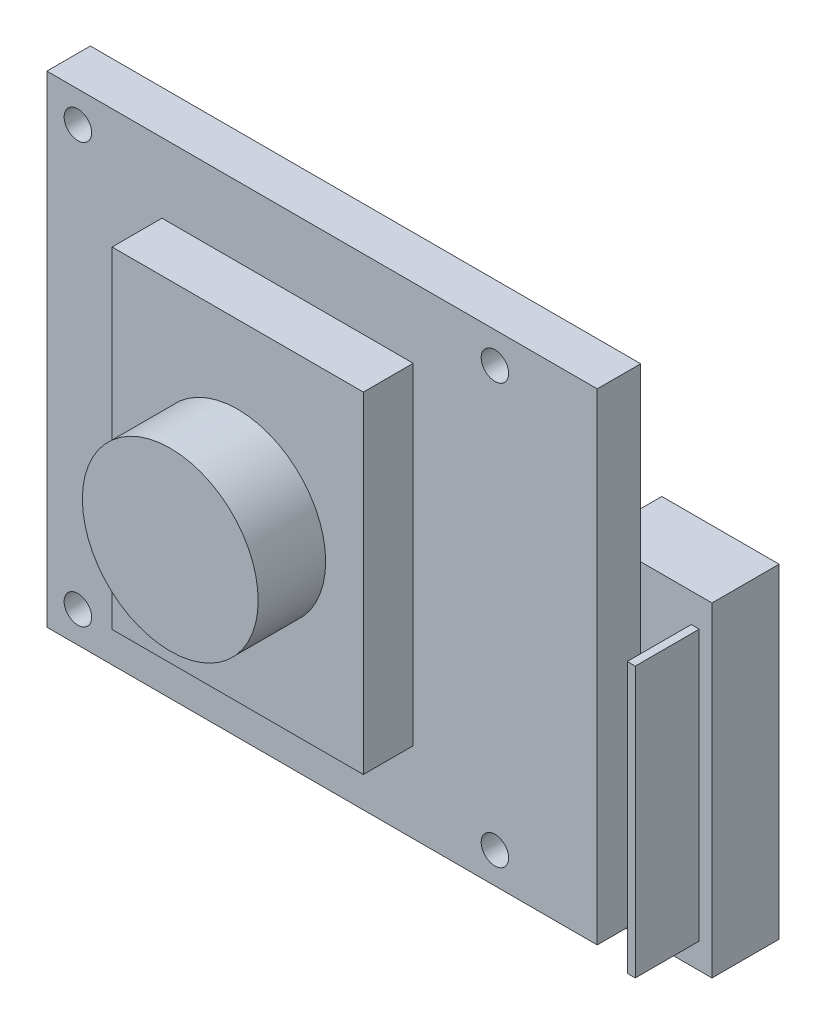
ISO-10303-21;
HEADER;
FILE_DESCRIPTION(('STEP AP214'),'2;1');
FILE_NAME('part.step','',(''),(''),'','','');
FILE_SCHEMA(('AUTOMOTIVE_DESIGN { 1 0 10303 214 1 1 1 1 }'));
ENDSEC;
DATA;
#1=APPLICATION_CONTEXT('core data for automotive mechanical design processes');
#2=APPLICATION_PROTOCOL_DEFINITION('international standard','automotive_design',2000,#1);
#3=PRODUCT_CONTEXT('',#1,'mechanical');
#4=PRODUCT('Part','Part','',(#3));
#5=PRODUCT_RELATED_PRODUCT_CATEGORY('part','',(#4));
#6=PRODUCT_DEFINITION_FORMATION('','',#4);
#7=PRODUCT_DEFINITION_CONTEXT('part definition',#1,'design');
#8=PRODUCT_DEFINITION('design','',#6,#7);
#9=PRODUCT_DEFINITION_SHAPE('','',#8);
#10=(LENGTH_UNIT() NAMED_UNIT(*) SI_UNIT(.MILLI.,.METRE.));
#11=(NAMED_UNIT(*) PLANE_ANGLE_UNIT() SI_UNIT($,.RADIAN.));
#12=(NAMED_UNIT(*) SI_UNIT($,.STERADIAN.) SOLID_ANGLE_UNIT());
#13=UNCERTAINTY_MEASURE_WITH_UNIT(LENGTH_MEASURE(1.E-05),#10,'distance_accuracy_value','');
#14=(GEOMETRIC_REPRESENTATION_CONTEXT(3) GLOBAL_UNCERTAINTY_ASSIGNED_CONTEXT((#13)) GLOBAL_UNIT_ASSIGNED_CONTEXT((#10,
#11,#12)) REPRESENTATION_CONTEXT('',''));
#15=CARTESIAN_POINT('',(0.,0.,0.));
#16=DIRECTION('',(0.,0.,1.));
#17=DIRECTION('',(1.,0.,0.));
#18=AXIS2_PLACEMENT_3D('',#15,#16,#17);
#19=CARTESIAN_POINT('',(-43.7261,38.2651,0.));
#20=DIRECTION('',(0.,0.,-1.));
#21=DIRECTION('',(-1.,0.,0.));
#22=AXIS2_PLACEMENT_3D('',#19,#20,#21);
#23=PLANE('',#22);
#24=CARTESIAN_POINT('',(-25.4381,30.0482,0.));
#25=DIRECTION('',(0.,0.,-1.));
#26=DIRECTION('',(-1.,0.,0.));
#27=AXIS2_PLACEMENT_3D('',#24,#25,#26);
#28=CIRCLE('',#27,1.524);
#29=CARTESIAN_POINT('',(-26.9621,30.0482,0.));
#30=VERTEX_POINT('',#29);
#31=EDGE_CURVE('E452',#30,#30,#28,.T.);
#32=ORIENTED_EDGE('',*,*,#31,.F.);
#33=EDGE_LOOP('',(#32));
#34=FACE_BOUND('',#33,.T.);
#35=CARTESIAN_POINT('',(-8.128,35.8013,0.));
#36=DIRECTION('',(0.,0.,-1.));
#37=DIRECTION('',(-1.,0.,0.));
#38=AXIS2_PLACEMENT_3D('',#35,#36,#37);
#39=CIRCLE('',#38,1.0922);
#40=CARTESIAN_POINT('',(-9.2202,35.8013,0.));
#41=VERTEX_POINT('',#40);
#42=EDGE_CURVE('E173',#41,#41,#39,.T.);
#43=ORIENTED_EDGE('',*,*,#42,.F.);
#44=EDGE_LOOP('',(#43));
#45=FACE_BOUND('',#44,.T.);
#46=CARTESIAN_POINT('',(-8.128,2.4638,0.));
#47=DIRECTION('',(0.,0.,-1.));
#48=DIRECTION('',(-1.,0.,0.));
#49=AXIS2_PLACEMENT_3D('',#46,#47,#48);
#50=CIRCLE('',#49,1.0922);
#51=CARTESIAN_POINT('',(-9.2202,2.4638,0.));
#52=VERTEX_POINT('',#51);
#53=EDGE_CURVE('E184',#52,#52,#50,.T.);
#54=ORIENTED_EDGE('',*,*,#53,.F.);
#55=EDGE_LOOP('',(#54));
#56=FACE_BOUND('',#55,.T.);
#57=CARTESIAN_POINT('',(-41.2623,2.4638,0.));
#58=DIRECTION('',(0.,0.,-1.));
#59=DIRECTION('',(-1.,0.,0.));
#60=AXIS2_PLACEMENT_3D('',#57,#58,#59);
#61=CIRCLE('',#60,1.0922);
#62=CARTESIAN_POINT('',(-42.3545,2.4638,0.));
#63=VERTEX_POINT('',#62);
#64=EDGE_CURVE('E190',#63,#63,#61,.T.);
#65=ORIENTED_EDGE('',*,*,#64,.F.);
#66=EDGE_LOOP('',(#65));
#67=FACE_BOUND('',#66,.T.);
#68=CARTESIAN_POINT('',(-41.2623,35.8013,0.));
#69=DIRECTION('',(0.,0.,-1.));
#70=DIRECTION('',(-1.,0.,0.));
#71=AXIS2_PLACEMENT_3D('',#68,#69,#70);
#72=CIRCLE('',#71,1.0922);
#73=CARTESIAN_POINT('',(-42.3545,35.8013,0.));
#74=VERTEX_POINT('',#73);
#75=EDGE_CURVE('E196',#74,#74,#72,.T.);
#76=ORIENTED_EDGE('',*,*,#75,.F.);
#77=EDGE_LOOP('',(#76));
#78=FACE_BOUND('',#77,.T.);
#79=DIRECTION('',(0.,1.,0.));
#80=VECTOR('',#79,1.);
#81=CARTESIAN_POINT('',(-3.6576,-1.1684,0.));
#82=LINE('',#81,#80);
#83=CARTESIAN_POINT('',(-3.65760000000001,0.,0.));
#84=VERTEX_POINT('',#83);
#85=CARTESIAN_POINT('',(-3.6576,24.638,0.));
#86=VERTEX_POINT('',#85);
#87=EDGE_CURVE('E40',#84,#86,#82,.T.);
#88=ORIENTED_EDGE('',*,*,#87,.F.);
#89=DIRECTION('',(1.,0.,0.));
#90=VECTOR('',#89,1.);
#91=CARTESIAN_POINT('',(-43.7261,0.,0.));
#92=LINE('',#91,#90);
#93=CARTESIAN_POINT('',(-43.7261,0.,0.));
#94=VERTEX_POINT('',#93);
#95=EDGE_CURVE('E282',#94,#84,#92,.T.);
#96=ORIENTED_EDGE('',*,*,#95,.F.);
#97=DIRECTION('',(0.,-1.,0.));
#98=VECTOR('',#97,1.);
#99=CARTESIAN_POINT('',(-43.7261,0.,0.));
#100=LINE('',#99,#98);
#101=CARTESIAN_POINT('',(-43.7261,38.2651,0.));
#102=VERTEX_POINT('',#101);
#103=EDGE_CURVE('E267',#102,#94,#100,.T.);
#104=ORIENTED_EDGE('',*,*,#103,.F.);
#105=DIRECTION('',(-1.,0.,0.));
#106=VECTOR('',#105,1.);
#107=CARTESIAN_POINT('',(-43.7261,38.2651,0.));
#108=LINE('',#107,#106);
#109=CARTESIAN_POINT('',(0.,38.2651,0.));
#110=VERTEX_POINT('',#109);
#111=EDGE_CURVE('E272',#110,#102,#108,.T.);
#112=ORIENTED_EDGE('',*,*,#111,.F.);
#113=DIRECTION('',(0.,1.,0.));
#114=VECTOR('',#113,1.);
#115=CARTESIAN_POINT('',(0.,0.,0.));
#116=LINE('',#115,#114);
#117=CARTESIAN_POINT('',(0.,24.638,0.));
#118=VERTEX_POINT('',#117);
#119=EDGE_CURVE('E285',#118,#110,#116,.T.);
#120=ORIENTED_EDGE('',*,*,#119,.F.);
#121=DIRECTION('',(1.,0.,0.));
#122=VECTOR('',#121,1.);
#123=CARTESIAN_POINT('',(-3.6576,24.638,0.));
#124=LINE('',#123,#122);
#125=EDGE_CURVE('E250',#86,#118,#124,.T.);
#126=ORIENTED_EDGE('',*,*,#125,.F.);
#127=EDGE_LOOP('',(#88,#96,#104,#112,#120,#126));
#128=FACE_BOUND('',#127,.T.);
#129=CARTESIAN_POINT('',(-25.4381,8.128,0.));
#130=DIRECTION('',(0.,0.,-1.));
#131=DIRECTION('',(-1.,0.,0.));
#132=AXIS2_PLACEMENT_3D('',#129,#130,#131);
#133=CIRCLE('',#132,1.524);
#134=CARTESIAN_POINT('',(-26.9621,8.128,0.));
#135=VERTEX_POINT('',#134);
#136=EDGE_CURVE('E453',#135,#135,#133,.T.);
#137=ORIENTED_EDGE('',*,*,#136,.F.);
#138=EDGE_LOOP('',(#137));
#139=FACE_BOUND('',#138,.T.);
#140=ADVANCED_FACE('F32',(#34,#45,#56,#67,#78,#128,#139),#23,.T.);
#141=CARTESIAN_POINT('',(-34.5821,32.7152,7.4168));
#142=DIRECTION('',(0.,0.,-1.));
#143=DIRECTION('',(-1.,0.,0.));
#144=AXIS2_PLACEMENT_3D('',#141,#142,#143);
#145=PLANE('',#144);
#146=DIRECTION('',(0.,-1.,0.));
#147=VECTOR('',#146,1.);
#148=CARTESIAN_POINT('',(-34.5821,6.4008,7.4168));
#149=LINE('',#148,#147);
#150=CARTESIAN_POINT('',(-34.5821,32.7152,7.4168));
#151=VERTEX_POINT('',#150);
#152=CARTESIAN_POINT('',(-34.5821,6.4008,7.4168));
#153=VERTEX_POINT('',#152);
#154=EDGE_CURVE('E159',#151,#153,#149,.T.);
#155=ORIENTED_EDGE('',*,*,#154,.T.);
#156=DIRECTION('',(1.,0.,0.));
#157=VECTOR('',#156,1.);
#158=CARTESIAN_POINT('',(-34.5821,6.4008,7.4168));
#159=LINE('',#158,#157);
#160=CARTESIAN_POINT('',(-14.6177,6.4008,7.4168));
#161=VERTEX_POINT('',#160);
#162=EDGE_CURVE('E148',#153,#161,#159,.T.);
#163=ORIENTED_EDGE('',*,*,#162,.T.);
#164=DIRECTION('',(0.,1.,0.));
#165=VECTOR('',#164,1.);
#166=CARTESIAN_POINT('',(-14.6177,6.4008,7.4168));
#167=LINE('',#166,#165);
#168=CARTESIAN_POINT('',(-14.6177,32.7152,7.4168));
#169=VERTEX_POINT('',#168);
#170=EDGE_CURVE('E158',#161,#169,#167,.T.);
#171=ORIENTED_EDGE('',*,*,#170,.T.);
#172=DIRECTION('',(-1.,0.,0.));
#173=VECTOR('',#172,1.);
#174=CARTESIAN_POINT('',(-34.5821,32.7152,7.4168));
#175=LINE('',#174,#173);
#176=EDGE_CURVE('E165',#169,#151,#175,.T.);
#177=ORIENTED_EDGE('',*,*,#176,.T.);
#178=EDGE_LOOP('',(#155,#163,#171,#177));
#179=FACE_BOUND('',#178,.T.);
#180=CARTESIAN_POINT('',(-24.5999,19.558,7.4168));
#181=DIRECTION('',(0.,0.,-1.));
#182=DIRECTION('',(-1.,0.,0.));
#183=AXIS2_PLACEMENT_3D('',#180,#181,#182);
#184=CIRCLE('',#183,6.985);
#185=CARTESIAN_POINT('',(-31.5849,19.558,7.4168));
#186=VERTEX_POINT('',#185);
#187=EDGE_CURVE('E11',#186,#186,#184,.F.);
#188=ORIENTED_EDGE('',*,*,#187,.F.);
#189=EDGE_LOOP('',(#188));
#190=FACE_BOUND('',#189,.T.);
#191=ADVANCED_FACE('F162',(#179,#190),#145,.F.);
#192=CARTESIAN_POINT('',(-43.7261,38.2651,3.4544));
#193=DIRECTION('',(0.,0.,-1.));
#194=DIRECTION('',(-1.,0.,0.));
#195=AXIS2_PLACEMENT_3D('',#192,#193,#194);
#196=PLANE('',#195);
#197=DIRECTION('',(0.,-1.,0.));
#198=VECTOR('',#197,1.);
#199=CARTESIAN_POINT('',(-43.7261,0.,3.4544));
#200=LINE('',#199,#198);
#201=CARTESIAN_POINT('',(-43.7261,38.2651,3.4544));
#202=VERTEX_POINT('',#201);
#203=CARTESIAN_POINT('',(-43.7261,0.,3.4544));
#204=VERTEX_POINT('',#203);
#205=EDGE_CURVE('E268',#202,#204,#200,.T.);
#206=ORIENTED_EDGE('',*,*,#205,.T.);
#207=DIRECTION('',(1.,0.,0.));
#208=VECTOR('',#207,1.);
#209=CARTESIAN_POINT('',(-43.7261,0.,3.4544));
#210=LINE('',#209,#208);
#211=CARTESIAN_POINT('',(0.,0.,3.4544));
#212=VERTEX_POINT('',#211);
#213=EDGE_CURVE('E271',#204,#212,#210,.T.);
#214=ORIENTED_EDGE('',*,*,#213,.T.);
#215=DIRECTION('',(0.,1.,0.));
#216=VECTOR('',#215,1.);
#217=CARTESIAN_POINT('',(0.,0.,3.4544));
#218=LINE('',#217,#216);
#219=CARTESIAN_POINT('',(0.,38.2651,3.4544));
#220=VERTEX_POINT('',#219);
#221=EDGE_CURVE('E274',#212,#220,#218,.T.);
#222=ORIENTED_EDGE('',*,*,#221,.T.);
#223=DIRECTION('',(-1.,0.,0.));
#224=VECTOR('',#223,1.);
#225=CARTESIAN_POINT('',(-43.7261,38.2651,3.4544));
#226=LINE('',#225,#224);
#227=EDGE_CURVE('E276',#220,#202,#226,.T.);
#228=ORIENTED_EDGE('',*,*,#227,.T.);
#229=EDGE_LOOP('',(#206,#214,#222,#228));
#230=FACE_BOUND('',#229,.T.);
#231=CARTESIAN_POINT('',(-41.2623,35.8013,3.4544));
#232=DIRECTION('',(0.,0.,-1.));
#233=DIRECTION('',(-1.,0.,0.));
#234=AXIS2_PLACEMENT_3D('',#231,#232,#233);
#235=CIRCLE('',#234,1.0922);
#236=CARTESIAN_POINT('',(-42.3545,35.8013,3.4544));
#237=VERTEX_POINT('',#236);
#238=EDGE_CURVE('E199',#237,#237,#235,.T.);
#239=ORIENTED_EDGE('',*,*,#238,.T.);
#240=EDGE_LOOP('',(#239));
#241=FACE_BOUND('',#240,.T.);
#242=CARTESIAN_POINT('',(-41.2623,2.4638,3.4544));
#243=DIRECTION('',(0.,0.,-1.));
#244=DIRECTION('',(-1.,0.,0.));
#245=AXIS2_PLACEMENT_3D('',#242,#243,#244);
#246=CIRCLE('',#245,1.0922);
#247=CARTESIAN_POINT('',(-42.3545,2.4638,3.4544));
#248=VERTEX_POINT('',#247);
#249=EDGE_CURVE('E193',#248,#248,#246,.T.);
#250=ORIENTED_EDGE('',*,*,#249,.T.);
#251=EDGE_LOOP('',(#250));
#252=FACE_BOUND('',#251,.T.);
#253=CARTESIAN_POINT('',(-8.128,2.4638,3.4544));
#254=DIRECTION('',(0.,0.,-1.));
#255=DIRECTION('',(-1.,0.,0.));
#256=AXIS2_PLACEMENT_3D('',#253,#254,#255);
#257=CIRCLE('',#256,1.0922);
#258=CARTESIAN_POINT('',(-9.2202,2.4638,3.4544));
#259=VERTEX_POINT('',#258);
#260=EDGE_CURVE('E187',#259,#259,#257,.T.);
#261=ORIENTED_EDGE('',*,*,#260,.T.);
#262=EDGE_LOOP('',(#261));
#263=FACE_BOUND('',#262,.T.);
#264=CARTESIAN_POINT('',(-8.128,35.8013,3.4544));
#265=DIRECTION('',(0.,0.,-1.));
#266=DIRECTION('',(-1.,0.,0.));
#267=AXIS2_PLACEMENT_3D('',#264,#265,#266);
#268=CIRCLE('',#267,1.0922);
#269=CARTESIAN_POINT('',(-9.2202,35.8013,3.4544));
#270=VERTEX_POINT('',#269);
#271=EDGE_CURVE('E176',#270,#270,#268,.T.);
#272=ORIENTED_EDGE('',*,*,#271,.T.);
#273=EDGE_LOOP('',(#272));
#274=FACE_BOUND('',#273,.T.);
#275=DIRECTION('',(0.,-1.,0.));
#276=VECTOR('',#275,1.);
#277=CARTESIAN_POINT('',(-34.5821,6.4008,3.4544));
#278=LINE('',#277,#276);
#279=CARTESIAN_POINT('',(-34.5821,32.7152,3.4544));
#280=VERTEX_POINT('',#279);
#281=CARTESIAN_POINT('',(-34.5821,6.4008,3.4544));
#282=VERTEX_POINT('',#281);
#283=EDGE_CURVE('E172',#280,#282,#278,.T.);
#284=ORIENTED_EDGE('',*,*,#283,.F.);
#285=DIRECTION('',(-1.,0.,0.));
#286=VECTOR('',#285,1.);
#287=CARTESIAN_POINT('',(-34.5821,32.7152,3.4544));
#288=LINE('',#287,#286);
#289=CARTESIAN_POINT('',(-14.6177,32.7152,3.4544));
#290=VERTEX_POINT('',#289);
#291=EDGE_CURVE('E169',#290,#280,#288,.T.);
#292=ORIENTED_EDGE('',*,*,#291,.F.);
#293=DIRECTION('',(0.,1.,0.));
#294=VECTOR('',#293,1.);
#295=CARTESIAN_POINT('',(-14.6177,6.4008,3.4544));
#296=LINE('',#295,#294);
#297=CARTESIAN_POINT('',(-14.6177,6.4008,3.4544));
#298=VERTEX_POINT('',#297);
#299=EDGE_CURVE('E52',#298,#290,#296,.T.);
#300=ORIENTED_EDGE('',*,*,#299,.F.);
#301=DIRECTION('',(1.,0.,0.));
#302=VECTOR('',#301,1.);
#303=CARTESIAN_POINT('',(-34.5821,6.4008,3.4544));
#304=LINE('',#303,#302);
#305=EDGE_CURVE('E47',#282,#298,#304,.T.);
#306=ORIENTED_EDGE('',*,*,#305,.F.);
#307=EDGE_LOOP('',(#284,#292,#300,#306));
#308=FACE_BOUND('',#307,.T.);
#309=ADVANCED_FACE('F333',(#230,#241,#252,#263,#274,#308),#196,.F.);
#310=CARTESIAN_POINT('',(-3.6576,24.638,0.));
#311=DIRECTION('',(0.,0.,-1.));
#312=DIRECTION('',(-1.,0.,0.));
#313=AXIS2_PLACEMENT_3D('',#310,#311,#312);
#314=PLANE('',#313);
#315=CARTESIAN_POINT('',(0.,0.,0.));
#316=VERTEX_POINT('',#315);
#317=EDGE_CURVE('E286',#316,#118,#116,.T.);
#318=ORIENTED_EDGE('',*,*,#317,.F.);
#319=EDGE_CURVE('E281',#84,#316,#92,.T.);
#320=ORIENTED_EDGE('',*,*,#319,.F.);
#321=CARTESIAN_POINT('',(-3.6576,-1.1684,0.));
#322=VERTEX_POINT('',#321);
#323=EDGE_CURVE('E235',#322,#84,#82,.T.);
#324=ORIENTED_EDGE('',*,*,#323,.F.);
#325=DIRECTION('',(-1.,0.,0.));
#326=VECTOR('',#325,1.);
#327=CARTESIAN_POINT('',(-3.6576,-1.1684,0.));
#328=LINE('',#327,#326);
#329=CARTESIAN_POINT('',(5.6642,-1.1684,0.));
#330=VERTEX_POINT('',#329);
#331=EDGE_CURVE('E240',#330,#322,#328,.T.);
#332=ORIENTED_EDGE('',*,*,#331,.F.);
#333=DIRECTION('',(0.,-1.,0.));
#334=VECTOR('',#333,1.);
#335=CARTESIAN_POINT('',(5.6642,-1.1684,0.));
#336=LINE('',#335,#334);
#337=CARTESIAN_POINT('',(5.6642,24.638,0.));
#338=VERTEX_POINT('',#337);
#339=EDGE_CURVE('E253',#338,#330,#336,.T.);
#340=ORIENTED_EDGE('',*,*,#339,.F.);
#341=EDGE_CURVE('E249',#118,#338,#124,.T.);
#342=ORIENTED_EDGE('',*,*,#341,.F.);
#343=EDGE_LOOP('',(#318,#320,#324,#332,#340,#342));
#344=FACE_BOUND('',#343,.T.);
#345=DIRECTION('',(0.,-1.,0.));
#346=VECTOR('',#345,1.);
#347=CARTESIAN_POINT('',(4.0132,0.863599999999999,0.));
#348=LINE('',#347,#346);
#349=CARTESIAN_POINT('',(4.0132,22.3266,0.));
#350=VERTEX_POINT('',#349);
#351=CARTESIAN_POINT('',(4.0132,0.863599999999999,0.));
#352=VERTEX_POINT('',#351);
#353=EDGE_CURVE('E202',#350,#352,#348,.T.);
#354=ORIENTED_EDGE('',*,*,#353,.F.);
#355=DIRECTION('',(-1.,0.,0.));
#356=VECTOR('',#355,1.);
#357=CARTESIAN_POINT('',(4.0132,22.3266,0.));
#358=LINE('',#357,#356);
#359=CARTESIAN_POINT('',(4.6482,22.3266,0.));
#360=VERTEX_POINT('',#359);
#361=EDGE_CURVE('E207',#360,#350,#358,.T.);
#362=ORIENTED_EDGE('',*,*,#361,.F.);
#363=DIRECTION('',(0.,1.,0.));
#364=VECTOR('',#363,1.);
#365=CARTESIAN_POINT('',(4.6482,0.863599999999999,0.));
#366=LINE('',#365,#364);
#367=CARTESIAN_POINT('',(4.6482,0.863599999999999,0.));
#368=VERTEX_POINT('',#367);
#369=EDGE_CURVE('E219',#368,#360,#366,.T.);
#370=ORIENTED_EDGE('',*,*,#369,.F.);
#371=DIRECTION('',(1.,0.,0.));
#372=VECTOR('',#371,1.);
#373=CARTESIAN_POINT('',(4.0132,0.863599999999999,0.));
#374=LINE('',#373,#372);
#375=EDGE_CURVE('E216',#352,#368,#374,.T.);
#376=ORIENTED_EDGE('',*,*,#375,.F.);
#377=EDGE_LOOP('',(#354,#362,#370,#376));
#378=FACE_BOUND('',#377,.T.);
#379=ADVANCED_FACE('F320',(#344,#378),#314,.F.);
#380=CARTESIAN_POINT('',(-43.7261,0.,3.4544));
#381=DIRECTION('',(1.,0.,0.));
#382=DIRECTION('',(0.,0.,-1.));
#383=AXIS2_PLACEMENT_3D('',#380,#381,#382);
#384=PLANE('',#383);
#385=ORIENTED_EDGE('',*,*,#103,.T.);
#386=DIRECTION('',(0.,0.,-1.));
#387=VECTOR('',#386,1.);
#388=CARTESIAN_POINT('',(-43.7261,0.,3.4544));
#389=LINE('',#388,#387);
#390=EDGE_CURVE('E296',#204,#94,#389,.T.);
#391=ORIENTED_EDGE('',*,*,#390,.F.);
#392=ORIENTED_EDGE('',*,*,#205,.F.);
#393=DIRECTION('',(0.,0.,-1.));
#394=VECTOR('',#393,1.);
#395=CARTESIAN_POINT('',(-43.7261,38.2651,3.4544));
#396=LINE('',#395,#394);
#397=EDGE_CURVE('E278',#202,#102,#396,.T.);
#398=ORIENTED_EDGE('',*,*,#397,.T.);
#399=EDGE_LOOP('',(#385,#391,#392,#398));
#400=FACE_BOUND('',#399,.T.);
#401=ADVANCED_FACE('F34',(#400),#384,.F.);
#402=CARTESIAN_POINT('',(-43.7261,0.,3.4544));
#403=DIRECTION('',(0.,1.,0.));
#404=DIRECTION('',(0.,0.,1.));
#405=AXIS2_PLACEMENT_3D('',#402,#403,#404);
#406=PLANE('',#405);
#407=ORIENTED_EDGE('',*,*,#95,.T.);
#408=ORIENTED_EDGE('',*,*,#319,.T.);
#409=DIRECTION('',(0.,0.,-1.));
#410=VECTOR('',#409,1.);
#411=CARTESIAN_POINT('',(0.,0.,3.4544));
#412=LINE('',#411,#410);
#413=EDGE_CURVE('E294',#212,#316,#412,.T.);
#414=ORIENTED_EDGE('',*,*,#413,.F.);
#415=ORIENTED_EDGE('',*,*,#213,.F.);
#416=ORIENTED_EDGE('',*,*,#390,.T.);
#417=EDGE_LOOP('',(#407,#408,#414,#415,#416));
#418=FACE_BOUND('',#417,.T.);
#419=ADVANCED_FACE('F325',(#418),#406,.F.);
#420=CARTESIAN_POINT('',(0.,0.,3.4544));
#421=DIRECTION('',(-1.,0.,0.));
#422=DIRECTION('',(0.,0.,1.));
#423=AXIS2_PLACEMENT_3D('',#420,#421,#422);
#424=PLANE('',#423);
#425=ORIENTED_EDGE('',*,*,#317,.T.);
#426=ORIENTED_EDGE('',*,*,#119,.T.);
#427=DIRECTION('',(0.,0.,-1.));
#428=VECTOR('',#427,1.);
#429=CARTESIAN_POINT('',(0.,38.2651,3.4544));
#430=LINE('',#429,#428);
#431=EDGE_CURVE('E291',#220,#110,#430,.T.);
#432=ORIENTED_EDGE('',*,*,#431,.F.);
#433=ORIENTED_EDGE('',*,*,#221,.F.);
#434=ORIENTED_EDGE('',*,*,#413,.T.);
#435=EDGE_LOOP('',(#425,#426,#432,#433,#434));
#436=FACE_BOUND('',#435,.T.);
#437=ADVANCED_FACE('F328',(#436),#424,.F.);
#438=CARTESIAN_POINT('',(-43.7261,38.2651,3.4544));
#439=DIRECTION('',(0.,-1.,0.));
#440=DIRECTION('',(0.,0.,-1.));
#441=AXIS2_PLACEMENT_3D('',#438,#439,#440);
#442=PLANE('',#441);
#443=ORIENTED_EDGE('',*,*,#111,.T.);
#444=ORIENTED_EDGE('',*,*,#397,.F.);
#445=ORIENTED_EDGE('',*,*,#227,.F.);
#446=ORIENTED_EDGE('',*,*,#431,.T.);
#447=EDGE_LOOP('',(#443,#444,#445,#446));
#448=FACE_BOUND('',#447,.T.);
#449=ADVANCED_FACE('F342',(#448),#442,.F.);
#450=CARTESIAN_POINT('',(-3.6576,-1.1684,-5.334));
#451=DIRECTION('',(1.,0.,0.));
#452=DIRECTION('',(0.,0.,-1.));
#453=AXIS2_PLACEMENT_3D('',#450,#451,#452);
#454=PLANE('',#453);
#455=ORIENTED_EDGE('',*,*,#323,.T.);
#456=ORIENTED_EDGE('',*,*,#87,.T.);
#457=DIRECTION('',(0.,0.,1.));
#458=VECTOR('',#457,1.);
#459=CARTESIAN_POINT('',(-3.6576,24.638,-5.334));
#460=LINE('',#459,#458);
#461=CARTESIAN_POINT('',(-3.6576,24.638,-5.334));
#462=VERTEX_POINT('',#461);
#463=EDGE_CURVE('E264',#462,#86,#460,.T.);
#464=ORIENTED_EDGE('',*,*,#463,.F.);
#465=DIRECTION('',(0.,1.,0.));
#466=VECTOR('',#465,1.);
#467=CARTESIAN_POINT('',(-3.6576,-1.1684,-5.334));
#468=LINE('',#467,#466);
#469=CARTESIAN_POINT('',(-3.6576,-1.1684,-5.334));
#470=VERTEX_POINT('',#469);
#471=EDGE_CURVE('E236',#470,#462,#468,.T.);
#472=ORIENTED_EDGE('',*,*,#471,.F.);
#473=DIRECTION('',(0.,0.,1.));
#474=VECTOR('',#473,1.);
#475=CARTESIAN_POINT('',(-3.6576,-1.1684,-5.334));
#476=LINE('',#475,#474);
#477=EDGE_CURVE('E246',#470,#322,#476,.T.);
#478=ORIENTED_EDGE('',*,*,#477,.T.);
#479=EDGE_LOOP('',(#455,#456,#464,#472,#478));
#480=FACE_BOUND('',#479,.T.);
#481=ADVANCED_FACE('F303',(#480),#454,.F.);
#482=CARTESIAN_POINT('',(-3.6576,24.638,-5.334));
#483=DIRECTION('',(0.,-1.,0.));
#484=DIRECTION('',(0.,0.,-1.));
#485=AXIS2_PLACEMENT_3D('',#482,#483,#484);
#486=PLANE('',#485);
#487=ORIENTED_EDGE('',*,*,#125,.T.);
#488=ORIENTED_EDGE('',*,*,#341,.T.);
#489=DIRECTION('',(0.,0.,1.));
#490=VECTOR('',#489,1.);
#491=CARTESIAN_POINT('',(5.6642,24.638,-5.334));
#492=LINE('',#491,#490);
#493=CARTESIAN_POINT('',(5.6642,24.638,-5.334));
#494=VERTEX_POINT('',#493);
#495=EDGE_CURVE('E261',#494,#338,#492,.T.);
#496=ORIENTED_EDGE('',*,*,#495,.F.);
#497=DIRECTION('',(1.,0.,0.));
#498=VECTOR('',#497,1.);
#499=CARTESIAN_POINT('',(-3.6576,24.638,-5.334));
#500=LINE('',#499,#498);
#501=EDGE_CURVE('E239',#462,#494,#500,.T.);
#502=ORIENTED_EDGE('',*,*,#501,.F.);
#503=ORIENTED_EDGE('',*,*,#463,.T.);
#504=EDGE_LOOP('',(#487,#488,#496,#502,#503));
#505=FACE_BOUND('',#504,.T.);
#506=ADVANCED_FACE('F308',(#505),#486,.F.);
#507=CARTESIAN_POINT('',(5.6642,-1.1684,-5.334));
#508=DIRECTION('',(-1.,0.,0.));
#509=DIRECTION('',(0.,0.,1.));
#510=AXIS2_PLACEMENT_3D('',#507,#508,#509);
#511=PLANE('',#510);
#512=ORIENTED_EDGE('',*,*,#339,.T.);
#513=DIRECTION('',(0.,0.,1.));
#514=VECTOR('',#513,1.);
#515=CARTESIAN_POINT('',(5.6642,-1.1684,-5.334));
#516=LINE('',#515,#514);
#517=CARTESIAN_POINT('',(5.6642,-1.1684,-5.334));
#518=VERTEX_POINT('',#517);
#519=EDGE_CURVE('E258',#518,#330,#516,.T.);
#520=ORIENTED_EDGE('',*,*,#519,.F.);
#521=DIRECTION('',(0.,-1.,0.));
#522=VECTOR('',#521,1.);
#523=CARTESIAN_POINT('',(5.6642,-1.1684,-5.334));
#524=LINE('',#523,#522);
#525=EDGE_CURVE('E242',#494,#518,#524,.T.);
#526=ORIENTED_EDGE('',*,*,#525,.F.);
#527=ORIENTED_EDGE('',*,*,#495,.T.);
#528=EDGE_LOOP('',(#512,#520,#526,#527));
#529=FACE_BOUND('',#528,.T.);
#530=ADVANCED_FACE('F365',(#529),#511,.F.);
#531=CARTESIAN_POINT('',(-3.6576,-1.1684,-5.334));
#532=DIRECTION('',(0.,1.,0.));
#533=DIRECTION('',(-1.,0.,0.));
#534=AXIS2_PLACEMENT_3D('',#531,#532,#533);
#535=PLANE('',#534);
#536=ORIENTED_EDGE('',*,*,#331,.T.);
#537=ORIENTED_EDGE('',*,*,#477,.F.);
#538=DIRECTION('',(-1.,0.,0.));
#539=VECTOR('',#538,1.);
#540=CARTESIAN_POINT('',(-3.6576,-1.1684,-5.334));
#541=LINE('',#540,#539);
#542=EDGE_CURVE('E244',#518,#470,#541,.T.);
#543=ORIENTED_EDGE('',*,*,#542,.F.);
#544=ORIENTED_EDGE('',*,*,#519,.T.);
#545=EDGE_LOOP('',(#536,#537,#543,#544));
#546=FACE_BOUND('',#545,.T.);
#547=ADVANCED_FACE('F368',(#546),#535,.F.);
#548=CARTESIAN_POINT('',(-3.6576,24.638,-5.334));
#549=DIRECTION('',(0.,0.,-1.));
#550=DIRECTION('',(-1.,0.,0.));
#551=AXIS2_PLACEMENT_3D('',#548,#549,#550);
#552=PLANE('',#551);
#553=ORIENTED_EDGE('',*,*,#471,.T.);
#554=ORIENTED_EDGE('',*,*,#501,.T.);
#555=ORIENTED_EDGE('',*,*,#525,.T.);
#556=ORIENTED_EDGE('',*,*,#542,.T.);
#557=EDGE_LOOP('',(#553,#554,#555,#556));
#558=FACE_BOUND('',#557,.T.);
#559=ADVANCED_FACE('F312',(#558),#552,.T.);
#560=CARTESIAN_POINT('',(4.0132,0.863599999999999,5.08));
#561=DIRECTION('',(1.,0.,0.));
#562=DIRECTION('',(0.,0.,-1.));
#563=AXIS2_PLACEMENT_3D('',#560,#561,#562);
#564=PLANE('',#563);
#565=ORIENTED_EDGE('',*,*,#353,.T.);
#566=DIRECTION('',(0.,0.,-1.));
#567=VECTOR('',#566,1.);
#568=CARTESIAN_POINT('',(4.0132,0.863599999999999,5.08));
#569=LINE('',#568,#567);
#570=CARTESIAN_POINT('',(4.0132,0.863599999999999,5.08));
#571=VERTEX_POINT('',#570);
#572=EDGE_CURVE('E232',#571,#352,#569,.T.);
#573=ORIENTED_EDGE('',*,*,#572,.F.);
#574=DIRECTION('',(0.,-1.,0.));
#575=VECTOR('',#574,1.);
#576=CARTESIAN_POINT('',(4.0132,0.863599999999999,5.08));
#577=LINE('',#576,#575);
#578=CARTESIAN_POINT('',(4.0132,22.3266,5.08));
#579=VERTEX_POINT('',#578);
#580=EDGE_CURVE('E203',#579,#571,#577,.T.);
#581=ORIENTED_EDGE('',*,*,#580,.F.);
#582=DIRECTION('',(0.,0.,-1.));
#583=VECTOR('',#582,1.);
#584=CARTESIAN_POINT('',(4.0132,22.3266,5.08));
#585=LINE('',#584,#583);
#586=EDGE_CURVE('E213',#579,#350,#585,.T.);
#587=ORIENTED_EDGE('',*,*,#586,.T.);
#588=EDGE_LOOP('',(#565,#573,#581,#587));
#589=FACE_BOUND('',#588,.T.);
#590=ADVANCED_FACE('F376',(#589),#564,.F.);
#591=CARTESIAN_POINT('',(4.0132,0.863599999999999,5.08));
#592=DIRECTION('',(0.,1.,0.));
#593=DIRECTION('',(0.,0.,1.));
#594=AXIS2_PLACEMENT_3D('',#591,#592,#593);
#595=PLANE('',#594);
#596=ORIENTED_EDGE('',*,*,#375,.T.);
#597=DIRECTION('',(0.,0.,-1.));
#598=VECTOR('',#597,1.);
#599=CARTESIAN_POINT('',(4.6482,0.863599999999999,5.08));
#600=LINE('',#599,#598);
#601=CARTESIAN_POINT('',(4.6482,0.863599999999999,5.08));
#602=VERTEX_POINT('',#601);
#603=EDGE_CURVE('E229',#602,#368,#600,.T.);
#604=ORIENTED_EDGE('',*,*,#603,.F.);
#605=DIRECTION('',(1.,0.,0.));
#606=VECTOR('',#605,1.);
#607=CARTESIAN_POINT('',(4.0132,0.863599999999999,5.08));
#608=LINE('',#607,#606);
#609=EDGE_CURVE('E206',#571,#602,#608,.T.);
#610=ORIENTED_EDGE('',*,*,#609,.F.);
#611=ORIENTED_EDGE('',*,*,#572,.T.);
#612=EDGE_LOOP('',(#596,#604,#610,#611));
#613=FACE_BOUND('',#612,.T.);
#614=ADVANCED_FACE('F379',(#613),#595,.F.);
#615=CARTESIAN_POINT('',(4.6482,0.863599999999999,5.08));
#616=DIRECTION('',(-1.,0.,0.));
#617=DIRECTION('',(0.,0.,1.));
#618=AXIS2_PLACEMENT_3D('',#615,#616,#617);
#619=PLANE('',#618);
#620=ORIENTED_EDGE('',*,*,#369,.T.);
#621=DIRECTION('',(0.,0.,-1.));
#622=VECTOR('',#621,1.);
#623=CARTESIAN_POINT('',(4.6482,22.3266,5.08));
#624=LINE('',#623,#622);
#625=CARTESIAN_POINT('',(4.6482,22.3266,5.08));
#626=VERTEX_POINT('',#625);
#627=EDGE_CURVE('E226',#626,#360,#624,.T.);
#628=ORIENTED_EDGE('',*,*,#627,.F.);
#629=DIRECTION('',(0.,1.,0.));
#630=VECTOR('',#629,1.);
#631=CARTESIAN_POINT('',(4.6482,0.863599999999999,5.08));
#632=LINE('',#631,#630);
#633=EDGE_CURVE('E209',#602,#626,#632,.T.);
#634=ORIENTED_EDGE('',*,*,#633,.F.);
#635=ORIENTED_EDGE('',*,*,#603,.T.);
#636=EDGE_LOOP('',(#620,#628,#634,#635));
#637=FACE_BOUND('',#636,.T.);
#638=ADVANCED_FACE('F383',(#637),#619,.F.);
#639=CARTESIAN_POINT('',(4.0132,22.3266,5.08));
#640=DIRECTION('',(0.,-1.,0.));
#641=DIRECTION('',(0.,0.,-1.));
#642=AXIS2_PLACEMENT_3D('',#639,#640,#641);
#643=PLANE('',#642);
#644=ORIENTED_EDGE('',*,*,#361,.T.);
#645=ORIENTED_EDGE('',*,*,#586,.F.);
#646=DIRECTION('',(-1.,0.,0.));
#647=VECTOR('',#646,1.);
#648=CARTESIAN_POINT('',(4.0132,22.3266,5.08));
#649=LINE('',#648,#647);
#650=EDGE_CURVE('E211',#626,#579,#649,.T.);
#651=ORIENTED_EDGE('',*,*,#650,.F.);
#652=ORIENTED_EDGE('',*,*,#627,.T.);
#653=EDGE_LOOP('',(#644,#645,#651,#652));
#654=FACE_BOUND('',#653,.T.);
#655=ADVANCED_FACE('F387',(#654),#643,.F.);
#656=CARTESIAN_POINT('',(4.0132,22.3266,5.08));
#657=DIRECTION('',(0.,0.,-1.));
#658=DIRECTION('',(-1.,0.,0.));
#659=AXIS2_PLACEMENT_3D('',#656,#657,#658);
#660=PLANE('',#659);
#661=ORIENTED_EDGE('',*,*,#580,.T.);
#662=ORIENTED_EDGE('',*,*,#609,.T.);
#663=ORIENTED_EDGE('',*,*,#633,.T.);
#664=ORIENTED_EDGE('',*,*,#650,.T.);
#665=EDGE_LOOP('',(#661,#662,#663,#664));
#666=FACE_BOUND('',#665,.T.);
#667=ADVANCED_FACE('F391',(#666),#660,.F.);
#668=CARTESIAN_POINT('',(-41.2623,35.8013,5.08));
#669=DIRECTION('',(0.,0.,-1.));
#670=DIRECTION('',(-1.,0.,0.));
#671=AXIS2_PLACEMENT_3D('',#668,#669,#670);
#672=CYLINDRICAL_SURFACE('',#671,1.0922);
#673=ORIENTED_EDGE('',*,*,#75,.T.);
#674=EDGE_LOOP('',(#673));
#675=FACE_BOUND('',#674,.T.);
#676=ORIENTED_EDGE('',*,*,#238,.F.);
#677=EDGE_LOOP('',(#676));
#678=FACE_BOUND('',#677,.T.);
#679=ADVANCED_FACE('F395',(#675,#678),#672,.F.);
#680=CARTESIAN_POINT('',(-41.2623,2.4638,5.08));
#681=DIRECTION('',(0.,0.,-1.));
#682=DIRECTION('',(-1.,0.,0.));
#683=AXIS2_PLACEMENT_3D('',#680,#681,#682);
#684=CYLINDRICAL_SURFACE('',#683,1.0922);
#685=ORIENTED_EDGE('',*,*,#64,.T.);
#686=EDGE_LOOP('',(#685));
#687=FACE_BOUND('',#686,.T.);
#688=ORIENTED_EDGE('',*,*,#249,.F.);
#689=EDGE_LOOP('',(#688));
#690=FACE_BOUND('',#689,.T.);
#691=ADVANCED_FACE('F399',(#687,#690),#684,.F.);
#692=CARTESIAN_POINT('',(-8.128,2.4638,5.08));
#693=DIRECTION('',(0.,0.,-1.));
#694=DIRECTION('',(-1.,0.,0.));
#695=AXIS2_PLACEMENT_3D('',#692,#693,#694);
#696=CYLINDRICAL_SURFACE('',#695,1.0922);
#697=ORIENTED_EDGE('',*,*,#53,.T.);
#698=EDGE_LOOP('',(#697));
#699=FACE_BOUND('',#698,.T.);
#700=ORIENTED_EDGE('',*,*,#260,.F.);
#701=EDGE_LOOP('',(#700));
#702=FACE_BOUND('',#701,.T.);
#703=ADVANCED_FACE('F403',(#699,#702),#696,.F.);
#704=CARTESIAN_POINT('',(-8.128,35.8013,5.08));
#705=DIRECTION('',(0.,0.,-1.));
#706=DIRECTION('',(-1.,0.,0.));
#707=AXIS2_PLACEMENT_3D('',#704,#705,#706);
#708=CYLINDRICAL_SURFACE('',#707,1.0922);
#709=ORIENTED_EDGE('',*,*,#42,.T.);
#710=EDGE_LOOP('',(#709));
#711=FACE_BOUND('',#710,.T.);
#712=ORIENTED_EDGE('',*,*,#271,.F.);
#713=EDGE_LOOP('',(#712));
#714=FACE_BOUND('',#713,.T.);
#715=ADVANCED_FACE('F407',(#711,#714),#708,.F.);
#716=CARTESIAN_POINT('',(-34.5821,6.4008,7.4168));
#717=DIRECTION('',(1.,0.,0.));
#718=DIRECTION('',(0.,0.,-1.));
#719=AXIS2_PLACEMENT_3D('',#716,#717,#718);
#720=PLANE('',#719);
#721=ORIENTED_EDGE('',*,*,#283,.T.);
#722=DIRECTION('',(0.,0.,-1.));
#723=VECTOR('',#722,1.);
#724=CARTESIAN_POINT('',(-34.5821,6.4008,7.4168));
#725=LINE('',#724,#723);
#726=EDGE_CURVE('E152',#153,#282,#725,.T.);
#727=ORIENTED_EDGE('',*,*,#726,.F.);
#728=ORIENTED_EDGE('',*,*,#154,.F.);
#729=DIRECTION('',(0.,0.,-1.));
#730=VECTOR('',#729,1.);
#731=CARTESIAN_POINT('',(-34.5821,32.7152,7.4168));
#732=LINE('',#731,#730);
#733=EDGE_CURVE('E468',#151,#280,#732,.T.);
#734=ORIENTED_EDGE('',*,*,#733,.T.);
#735=EDGE_LOOP('',(#721,#727,#728,#734));
#736=FACE_BOUND('',#735,.T.);
#737=ADVANCED_FACE('F171',(#736),#720,.F.);
#738=CARTESIAN_POINT('',(-34.5821,6.4008,7.4168));
#739=DIRECTION('',(0.,1.,0.));
#740=DIRECTION('',(0.,0.,1.));
#741=AXIS2_PLACEMENT_3D('',#738,#739,#740);
#742=PLANE('',#741);
#743=ORIENTED_EDGE('',*,*,#305,.T.);
#744=DIRECTION('',(0.,0.,-1.));
#745=VECTOR('',#744,1.);
#746=CARTESIAN_POINT('',(-14.6177,6.4008,7.4168));
#747=LINE('',#746,#745);
#748=EDGE_CURVE('E155',#161,#298,#747,.T.);
#749=ORIENTED_EDGE('',*,*,#748,.F.);
#750=ORIENTED_EDGE('',*,*,#162,.F.);
#751=ORIENTED_EDGE('',*,*,#726,.T.);
#752=EDGE_LOOP('',(#743,#749,#750,#751));
#753=FACE_BOUND('',#752,.T.);
#754=ADVANCED_FACE('F150',(#753),#742,.F.);
#755=CARTESIAN_POINT('',(-14.6177,6.4008,7.4168));
#756=DIRECTION('',(-1.,0.,0.));
#757=DIRECTION('',(0.,0.,1.));
#758=AXIS2_PLACEMENT_3D('',#755,#756,#757);
#759=PLANE('',#758);
#760=ORIENTED_EDGE('',*,*,#299,.T.);
#761=DIRECTION('',(0.,0.,-1.));
#762=VECTOR('',#761,1.);
#763=CARTESIAN_POINT('',(-14.6177,32.7152,7.4168));
#764=LINE('',#763,#762);
#765=EDGE_CURVE('E178',#169,#290,#764,.T.);
#766=ORIENTED_EDGE('',*,*,#765,.F.);
#767=ORIENTED_EDGE('',*,*,#170,.F.);
#768=ORIENTED_EDGE('',*,*,#748,.T.);
#769=EDGE_LOOP('',(#760,#766,#767,#768));
#770=FACE_BOUND('',#769,.T.);
#771=ADVANCED_FACE('F416',(#770),#759,.F.);
#772=CARTESIAN_POINT('',(-34.5821,32.7152,7.4168));
#773=DIRECTION('',(0.,-1.,0.));
#774=DIRECTION('',(0.,0.,-1.));
#775=AXIS2_PLACEMENT_3D('',#772,#773,#774);
#776=PLANE('',#775);
#777=ORIENTED_EDGE('',*,*,#291,.T.);
#778=ORIENTED_EDGE('',*,*,#733,.F.);
#779=ORIENTED_EDGE('',*,*,#176,.F.);
#780=ORIENTED_EDGE('',*,*,#765,.T.);
#781=EDGE_LOOP('',(#777,#778,#779,#780));
#782=FACE_BOUND('',#781,.T.);
#783=ADVANCED_FACE('F419',(#782),#776,.F.);
#784=CARTESIAN_POINT('',(-24.5999,19.558,6.2738));
#785=DIRECTION('',(0.,0.,1.));
#786=DIRECTION('',(1.,0.,0.));
#787=AXIS2_PLACEMENT_3D('',#784,#785,#786);
#788=CYLINDRICAL_SURFACE('',#787,6.985);
#789=CARTESIAN_POINT('',(-24.5999,19.558,12.7762));
#790=DIRECTION('',(0.,0.,-1.));
#791=DIRECTION('',(-1.,0.,0.));
#792=AXIS2_PLACEMENT_3D('',#789,#790,#791);
#793=CIRCLE('',#792,6.985);
#794=CARTESIAN_POINT('',(-31.5849,19.558,12.7762));
#795=VERTEX_POINT('',#794);
#796=EDGE_CURVE('E462',#795,#795,#793,.T.);
#797=ORIENTED_EDGE('',*,*,#796,.T.);
#798=EDGE_LOOP('',(#797));
#799=FACE_BOUND('',#798,.T.);
#800=ORIENTED_EDGE('',*,*,#187,.T.);
#801=EDGE_LOOP('',(#800));
#802=FACE_BOUND('',#801,.T.);
#803=ADVANCED_FACE('F422',(#799,#802),#788,.T.);
#804=CARTESIAN_POINT('',(-24.5999,19.558,12.7762));
#805=DIRECTION('',(0.,0.,-1.));
#806=DIRECTION('',(-1.,0.,0.));
#807=AXIS2_PLACEMENT_3D('',#804,#805,#806);
#808=PLANE('',#807);
#809=ORIENTED_EDGE('',*,*,#796,.F.);
#810=EDGE_LOOP('',(#809));
#811=FACE_BOUND('',#810,.T.);
#812=ADVANCED_FACE('F427',(#811),#808,.F.);
#813=CARTESIAN_POINT('',(-25.4381,30.0482,-3.6195));
#814=DIRECTION('',(0.,0.,1.));
#815=DIRECTION('',(1.,0.,0.));
#816=AXIS2_PLACEMENT_3D('',#813,#814,#815);
#817=CYLINDRICAL_SURFACE('',#816,1.524);
#818=CARTESIAN_POINT('',(-25.4381,30.0482,-3.6195));
#819=DIRECTION('',(0.,0.,-1.));
#820=DIRECTION('',(-1.,0.,0.));
#821=AXIS2_PLACEMENT_3D('',#818,#819,#820);
#822=CIRCLE('',#821,1.524);
#823=CARTESIAN_POINT('',(-26.9621,30.0482,-3.6195));
#824=VERTEX_POINT('',#823);
#825=EDGE_CURVE('E456',#824,#824,#822,.T.);
#826=ORIENTED_EDGE('',*,*,#825,.F.);
#827=EDGE_LOOP('',(#826));
#828=FACE_BOUND('',#827,.T.);
#829=ORIENTED_EDGE('',*,*,#31,.T.);
#830=EDGE_LOOP('',(#829));
#831=FACE_BOUND('',#830,.T.);
#832=ADVANCED_FACE('F431',(#828,#831),#817,.T.);
#833=CARTESIAN_POINT('',(-25.4381,30.0482,-3.6195));
#834=DIRECTION('',(0.,0.,-1.));
#835=DIRECTION('',(-1.,0.,0.));
#836=AXIS2_PLACEMENT_3D('',#833,#834,#835);
#837=PLANE('',#836);
#838=ORIENTED_EDGE('',*,*,#825,.T.);
#839=EDGE_LOOP('',(#838));
#840=FACE_BOUND('',#839,.T.);
#841=ADVANCED_FACE('F435',(#840),#837,.T.);
#842=CARTESIAN_POINT('',(-25.4381,8.128,-3.6195));
#843=DIRECTION('',(0.,0.,1.));
#844=DIRECTION('',(1.,0.,0.));
#845=AXIS2_PLACEMENT_3D('',#842,#843,#844);
#846=CYLINDRICAL_SURFACE('',#845,1.524);
#847=CARTESIAN_POINT('',(-25.4381,8.128,-3.6195));
#848=DIRECTION('',(0.,0.,-1.));
#849=DIRECTION('',(-1.,0.,0.));
#850=AXIS2_PLACEMENT_3D('',#847,#848,#849);
#851=CIRCLE('',#850,1.524);
#852=CARTESIAN_POINT('',(-26.9621,8.128,-3.6195));
#853=VERTEX_POINT('',#852);
#854=EDGE_CURVE('E451',#853,#853,#851,.T.);
#855=ORIENTED_EDGE('',*,*,#854,.F.);
#856=EDGE_LOOP('',(#855));
#857=FACE_BOUND('',#856,.T.);
#858=ORIENTED_EDGE('',*,*,#136,.T.);
#859=EDGE_LOOP('',(#858));
#860=FACE_BOUND('',#859,.T.);
#861=ADVANCED_FACE('F439',(#857,#860),#846,.T.);
#862=CARTESIAN_POINT('',(-25.4381,8.128,-3.6195));
#863=DIRECTION('',(0.,0.,-1.));
#864=DIRECTION('',(-1.,0.,0.));
#865=AXIS2_PLACEMENT_3D('',#862,#863,#864);
#866=PLANE('',#865);
#867=ORIENTED_EDGE('',*,*,#854,.T.);
#868=EDGE_LOOP('',(#867));
#869=FACE_BOUND('',#868,.T.);
#870=ADVANCED_FACE('F443',(#869),#866,.T.);
#871=CLOSED_SHELL('',(#140,#191,#309,#379,#401,#419,#437,#449,#481,#506,#530,#547,#559,#590,
#614,#638,#655,#667,#679,#691,#703,#715,#737,#754,#771,#783,#803,#812,#832,#841,#861,#870));
#872=MANIFOLD_SOLID_BREP('B2',#871);
#873=ADVANCED_BREP_SHAPE_REPRESENTATION('',(#18,#872),#14);
#874=SHAPE_DEFINITION_REPRESENTATION(#9,#873);
ENDSEC;
END-ISO-10303-21;
